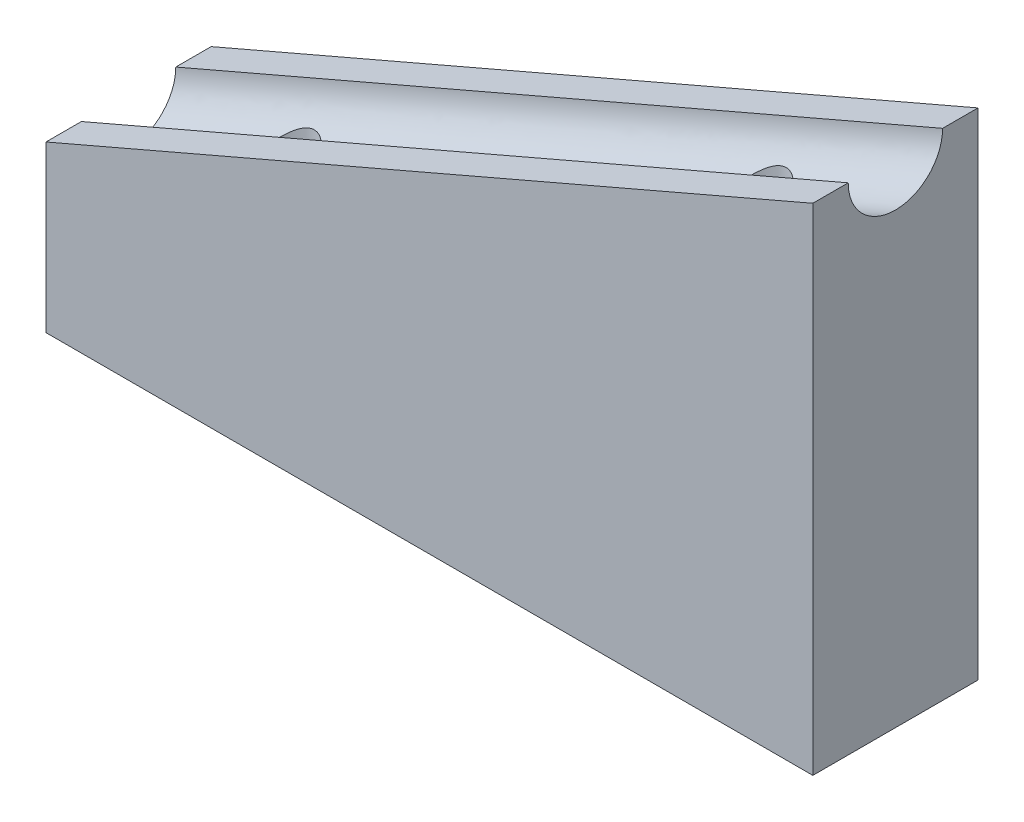
ISO-10303-21;
HEADER;
FILE_DESCRIPTION(('STEP AP214'),'2;1');
FILE_NAME('part.step','',(''),(''),'','','');
FILE_SCHEMA(('AUTOMOTIVE_DESIGN { 1 0 10303 214 1 1 1 1 }'));
ENDSEC;
DATA;
#1=APPLICATION_CONTEXT('core data for automotive mechanical design processes');
#2=APPLICATION_PROTOCOL_DEFINITION('international standard','automotive_design',2000,#1);
#3=PRODUCT_CONTEXT('',#1,'mechanical');
#4=PRODUCT('Part','Part','',(#3));
#5=PRODUCT_RELATED_PRODUCT_CATEGORY('part','',(#4));
#6=PRODUCT_DEFINITION_FORMATION('','',#4);
#7=PRODUCT_DEFINITION_CONTEXT('part definition',#1,'design');
#8=PRODUCT_DEFINITION('design','',#6,#7);
#9=PRODUCT_DEFINITION_SHAPE('','',#8);
#10=(LENGTH_UNIT() NAMED_UNIT(*) SI_UNIT(.MILLI.,.METRE.));
#11=(NAMED_UNIT(*) PLANE_ANGLE_UNIT() SI_UNIT($,.RADIAN.));
#12=(NAMED_UNIT(*) SI_UNIT($,.STERADIAN.) SOLID_ANGLE_UNIT());
#13=UNCERTAINTY_MEASURE_WITH_UNIT(LENGTH_MEASURE(1.E-05),#10,'distance_accuracy_value','');
#14=(GEOMETRIC_REPRESENTATION_CONTEXT(3) GLOBAL_UNCERTAINTY_ASSIGNED_CONTEXT((#13)) GLOBAL_UNIT_ASSIGNED_CONTEXT((#10,
#11,#12)) REPRESENTATION_CONTEXT('',''));
#15=CARTESIAN_POINT('',(0.,0.,0.));
#16=DIRECTION('',(0.,0.,1.));
#17=DIRECTION('',(1.,0.,0.));
#18=AXIS2_PLACEMENT_3D('',#15,#16,#17);
#19=CARTESIAN_POINT('',(10.,21.001,0.));
#20=DIRECTION('',(0.,-1.,0.));
#21=DIRECTION('',(0.,0.,-1.));
#22=AXIS2_PLACEMENT_3D('',#19,#20,#21);
#23=CYLINDRICAL_SURFACE('',#22,1.35);
#24=CARTESIAN_POINT('',(10.,0.,0.));
#25=DIRECTION('',(0.,-1.,0.));
#26=DIRECTION('',(0.,0.,-1.));
#27=AXIS2_PLACEMENT_3D('',#24,#25,#26);
#28=CIRCLE('',#27,1.35);
#29=CARTESIAN_POINT('',(10.,0.,-1.35));
#30=VERTEX_POINT('',#29);
#31=EDGE_CURVE('E120',#30,#30,#28,.T.);
#32=ORIENTED_EDGE('',*,*,#31,.T.);
#33=EDGE_LOOP('',(#32));
#34=FACE_BOUND('',#33,.T.);
#35=CARTESIAN_POINT('',(10.,16.8320568513549,-1.35));
#36=CARTESIAN_POINT('',(10.0581892493517,16.8571161828694,-1.34999695584091));
#37=CARTESIAN_POINT('',(10.117689879912,16.8792698979281,-1.34622545764739));
#38=CARTESIAN_POINT('',(10.2377178476309,16.9166195054488,-1.33028072745485));
#39=CARTESIAN_POINT('',(10.2982443067559,16.9318210645745,-1.31811435843607));
#40=CARTESIAN_POINT('',(10.4183067517538,16.9552191197305,-1.28506726812695));
#41=CARTESIAN_POINT('',(10.4778419767307,16.9634104575232,-1.26418014674654));
#42=CARTESIAN_POINT('',(10.5938454970746,16.9737970792146,-1.21402201849078));
#43=CARTESIAN_POINT('',(10.6503107457048,16.9759865093911,-1.18474285748452));
#44=CARTESIAN_POINT('',(10.7585966546614,16.9759879139981,-1.11851135167054));
#45=CARTESIAN_POINT('',(10.8104113736671,16.9737943698205,-1.08154938593606));
#46=CARTESIAN_POINT('',(10.9082166249761,16.9667089607962,-1.00083333683143));
#47=CARTESIAN_POINT('',(10.9542058850663,16.9618165077838,-0.957077774445919));
#48=CARTESIAN_POINT('',(11.0455561550492,16.9500324704395,-0.857041983091266));
#49=CARTESIAN_POINT('',(11.0899156590863,16.9429563388438,-0.799865699905447));
#50=CARTESIAN_POINT('',(11.1689625751605,16.9289621748495,-0.679143808270296));
#51=CARTESIAN_POINT('',(11.2036464353814,16.9220442013622,-0.615595872467857));
#52=CARTESIAN_POINT('',(11.2640939390793,16.9093239040538,-0.479973833817073));
#53=CARTESIAN_POINT('',(11.2892566835608,16.903604659213,-0.407622388865825));
#54=CARTESIAN_POINT('',(11.3270136238218,16.8948223855121,-0.259558005815488));
#55=CARTESIAN_POINT('',(11.3396095231221,16.8917589966402,-0.183845524781305));
#56=CARTESIAN_POINT('',(11.3516657231907,16.8888282136257,-0.0330427424830734));
#57=CARTESIAN_POINT('',(11.3514160171442,16.8888902611955,0.042023046605955));
#58=CARTESIAN_POINT('',(11.3385089190976,16.8920249988464,0.191008791146336));
#59=CARTESIAN_POINT('',(11.3258523863558,16.8950974804341,0.264928825588956));
#60=CARTESIAN_POINT('',(11.288769766755,16.9037127206374,0.408682104463888));
#61=CARTESIAN_POINT('',(11.2644803946633,16.9092267298171,0.478552509873517));
#62=CARTESIAN_POINT('',(11.204907102304,16.921793908186,0.613292438242508));
#63=CARTESIAN_POINT('',(11.169620957346,16.9288473887297,0.678160945982925));
#64=CARTESIAN_POINT('',(11.0879512091535,16.9433022911812,0.802842567213183));
#65=CARTESIAN_POINT('',(11.0413092760711,16.9507080009964,0.862486122799828));
#66=CARTESIAN_POINT('',(10.9385654063231,16.9636881199227,0.973296065277284));
#67=CARTESIAN_POINT('',(10.8824587763643,16.9692616164247,1.02445822138788));
#68=CARTESIAN_POINT('',(10.7623030576895,16.9759908713921,1.1167467014632));
#69=CARTESIAN_POINT('',(10.698261119534,16.9771505776888,1.15788196295112));
#70=CARTESIAN_POINT('',(10.5644372941803,16.9721178237646,1.22866215241053));
#71=CARTESIAN_POINT('',(10.4946676870027,16.9659407291358,1.25833092262822));
#72=CARTESIAN_POINT('',(10.3611372475985,16.9452604678489,1.30246538758772));
#73=CARTESIAN_POINT('',(10.2976700697109,16.9318544894469,1.31833569762009));
#74=CARTESIAN_POINT('',(10.1712249653992,16.8972281175589,1.34063730866518));
#75=CARTESIAN_POINT('',(10.108247157837,16.8760058826671,1.34706638366733));
#76=CARTESIAN_POINT('',(9.97582241174665,16.8231392121995,1.35163990487206));
#77=CARTESIAN_POINT('',(9.90676492875076,16.7904285387764,1.34844501165366));
#78=CARTESIAN_POINT('',(9.77322886838145,16.7185379305281,1.3325242380156));
#79=CARTESIAN_POINT('',(9.7087608867775,16.6793436783641,1.31977703878173));
#80=CARTESIAN_POINT('',(9.60274233034577,16.6089921470273,1.29103169017702));
#81=CARTESIAN_POINT('',(9.55996747514732,16.5788003927939,1.2770483634067));
#82=CARTESIAN_POINT('',(9.47677733798638,16.5171531408133,1.24527981623839));
#83=CARTESIAN_POINT('',(9.43636308109166,16.4856971039259,1.22749295959126));
#84=CARTESIAN_POINT('',(9.35774956612919,16.4220996922487,1.1882544821738));
#85=CARTESIAN_POINT('',(9.31955584974846,16.3899568554093,1.16679417896654));
#86=CARTESIAN_POINT('',(9.24544917438278,16.3256285372513,1.12029773421234));
#87=CARTESIAN_POINT('',(9.20953634167178,16.2934430536722,1.09526139493827));
#88=CARTESIAN_POINT('',(9.13910478511912,16.2287257177349,1.04086012182665));
#89=CARTESIAN_POINT('',(9.10464790839867,16.1962071585154,1.01139835068813));
#90=CARTESIAN_POINT('',(9.03833913378954,16.132329754604,0.948576872853809));
#91=CARTESIAN_POINT('',(9.00648809779086,16.1009712954824,0.9152158852696));
#92=CARTESIAN_POINT('',(8.91548062119563,16.0098842981942,0.809288450678186));
#93=CARTESIAN_POINT('',(8.86042568207587,15.9527252211936,0.73054317414034));
#94=CARTESIAN_POINT('',(8.78741583041091,15.8755160107623,0.595872463638503));
#95=CARTESIAN_POINT('',(8.76395716540502,15.8503905839175,0.545787051511079));
#96=CARTESIAN_POINT('',(8.72276830169219,15.8059434176366,0.440849220321658));
#97=CARTESIAN_POINT('',(8.70503381678295,15.7866173364811,0.386000407280323));
#98=CARTESIAN_POINT('',(8.67633888717587,15.7552129723191,0.27186835690804));
#99=CARTESIAN_POINT('',(8.66544916523486,15.7432103945573,0.212545696058065));
#100=CARTESIAN_POINT('',(8.6517666200703,15.728113756271,0.0918699466041976));
#101=CARTESIAN_POINT('',(8.64896511598708,15.7250101447578,0.030519106399103));
#102=CARTESIAN_POINT('',(8.65154208127767,15.7278584466396,-0.0834698906846887));
#103=CARTESIAN_POINT('',(8.65586873018173,15.7326459977453,-0.136167638812256));
#104=CARTESIAN_POINT('',(8.67042454393443,15.7486887353592,-0.239721103139412));
#105=CARTESIAN_POINT('',(8.68065628579402,15.7599467455981,-0.290576004807463));
#106=CARTESIAN_POINT('',(8.70928476449042,15.7912567068025,-0.400602968595962));
#107=CARTESIAN_POINT('',(8.72901325058667,15.8127305497315,-0.459019096897099));
#108=CARTESIAN_POINT('',(8.77490184537768,15.8621309754105,-0.570330312449072));
#109=CARTESIAN_POINT('',(8.80107377212832,15.89006940928,-0.623214997506417));
#110=CARTESIAN_POINT('',(8.87016411505526,15.9627613577984,-0.743317074956531));
#111=CARTESIAN_POINT('',(8.91558152076457,16.0097548293379,-0.807726227455414));
#112=CARTESIAN_POINT('',(9.01422702747777,16.1089011059169,-0.925567572302046));
#113=CARTESIAN_POINT('',(9.06746624886525,16.1610612214675,-0.978983871997904));
#114=CARTESIAN_POINT('',(9.18276839447812,16.2695908833411,-1.07730627354351));
#115=CARTESIAN_POINT('',(9.24508928603763,16.326045044971,-1.12181305256962));
#116=CARTESIAN_POINT('',(9.37677598998809,16.4384963552912,-1.19998467616572));
#117=CARTESIAN_POINT('',(9.44614848082725,16.4944930154439,-1.23363911444236));
#118=CARTESIAN_POINT('',(9.55560317330695,16.5755474882061,-1.27535346228652));
#119=CARTESIAN_POINT('',(9.59297336253112,16.6020667843079,-1.28779420214522));
#120=CARTESIAN_POINT('',(9.66960761653388,16.6536566569043,-1.3095531347228));
#121=CARTESIAN_POINT('',(9.70887197550838,16.678727007016,-1.31887084058504));
#122=CARTESIAN_POINT('',(9.78914544022837,16.7267612479474,-1.33405462289524));
#123=CARTESIAN_POINT('',(9.83014824546751,16.7497319284941,-1.33993218298276));
#124=CARTESIAN_POINT('',(9.91385792102711,16.7930258338396,-1.3479047088559));
#125=CARTESIAN_POINT('',(9.95656360043675,16.8133508678859,-1.35000227236666));
#126=CARTESIAN_POINT('',(10.,16.8320568513549,-1.35));
#127=B_SPLINE_CURVE_WITH_KNOTS('',3,(#35,#36,#37,#38,#39,#40,#41,#42,#43,#44,#45,#46,#47,#48,
#49,#50,#51,#52,#53,#54,#55,#56,#57,#58,#59,#60,#61,#62,#63,#64,#65,#66,#67,#68,#69,#70,#71,#72,
#73,#74,#75,#76,#77,#78,#79,#80,#81,#82,#83,#84,#85,#86,#87,#88,#89,#90,#91,#92,#93,#94,#95,#96,
#97,#98,#99,#100,#101,#102,#103,#104,#105,#106,#107,#108,#109,#110,#111,#112,#113,#114,#115,
#116,#117,#118,#119,#120,#121,#122,#123,#124,#125,#126),.UNSPECIFIED.,.T.,.F.,(4,2,2,2,2,2,2,2,
2,2,2,2,2,2,2,2,2,2,2,2,2,2,2,2,2,2,2,2,2,2,2,2,2,2,2,2,2,2,2,2,2,2,2,2,2,4),(0.,
0.189914865213358,0.379674654769765,0.56957395298367,0.759658396147937,0.949982325669388,
1.14034774834412,1.35753522981081,1.57480233367402,1.80411060840858,2.03338779463247,
2.25749130512457,2.48157929600038,2.70309601511104,2.92465757704781,3.15182822668951,
3.3791118571819,3.60619215029203,3.83279770249812,4.03200025757433,4.23124977216768,
4.45944732978611,4.68815570064973,4.85053848055404,5.01299125731481,5.17583344216987,
5.33868463442578,5.50583573359519,5.67304189686904,6.00539162628365,6.1870625452519,
6.36859711376722,6.55197780003594,6.73516159560541,6.89365057999023,7.05220878208597,
7.24700981380638,7.44217083146592,7.71594980639534,7.99012185236854,8.2746862985214,
8.55952280723489,8.70184138984278,8.84418214849949,8.98604500517831,9.12781033228462),.UNSPECIFIED.);
#128=CARTESIAN_POINT('',(10.,16.8320568513549,-1.35));
#129=VERTEX_POINT('',#128);
#130=EDGE_CURVE('E154',#129,#129,#127,.T.);
#131=ORIENTED_EDGE('',*,*,#130,.F.);
#132=EDGE_LOOP('',(#131));
#133=FACE_BOUND('',#132,.T.);
#134=ADVANCED_FACE('F35',(#34,#133),#23,.F.);
#135=CARTESIAN_POINT('',(-10.,21.001,0.));
#136=DIRECTION('',(0.,-1.,0.));
#137=DIRECTION('',(0.,0.,-1.));
#138=AXIS2_PLACEMENT_3D('',#135,#136,#137);
#139=CYLINDRICAL_SURFACE('',#138,1.35);
#140=CARTESIAN_POINT('',(-10.,0.,0.));
#141=DIRECTION('',(0.,-1.,0.));
#142=DIRECTION('',(0.,0.,-1.));
#143=AXIS2_PLACEMENT_3D('',#140,#141,#142);
#144=CIRCLE('',#143,1.35);
#145=CARTESIAN_POINT('',(-10.,0.,-1.35));
#146=VERTEX_POINT('',#145);
#147=EDGE_CURVE('E122',#146,#146,#144,.T.);
#148=ORIENTED_EDGE('',*,*,#147,.T.);
#149=EDGE_LOOP('',(#148));
#150=FACE_BOUND('',#149,.T.);
#151=CARTESIAN_POINT('',(-10.,8.21667223597033,-1.35));
#152=CARTESIAN_POINT('',(-9.94181075064834,8.24173156748476,-1.34999695584091));
#153=CARTESIAN_POINT('',(-9.88231012008804,8.26388528254346,-1.34622545764739));
#154=CARTESIAN_POINT('',(-9.76228215236914,8.30123489006425,-1.33028072745486));
#155=CARTESIAN_POINT('',(-9.70175569324409,8.31643644918985,-1.31811435843607));
#156=CARTESIAN_POINT('',(-9.58169324824615,8.33983450434588,-1.28506726812695));
#157=CARTESIAN_POINT('',(-9.52215802326931,8.34802584213864,-1.26418014674654));
#158=CARTESIAN_POINT('',(-9.40615450292535,8.35841246382998,-1.21402201849078));
#159=CARTESIAN_POINT('',(-9.3496892542952,8.36060189400646,-1.18474285748452));
#160=CARTESIAN_POINT('',(-9.24140334533858,8.36060329861345,-1.11851135167054));
#161=CARTESIAN_POINT('',(-9.1895886263329,8.35840975443589,-1.08154938593606));
#162=CARTESIAN_POINT('',(-9.09178337502392,8.35132434541155,-1.00083333683143));
#163=CARTESIAN_POINT('',(-9.04579411493368,8.34643189239917,-0.957077774445911));
#164=CARTESIAN_POINT('',(-8.95444384495083,8.33464785505488,-0.857041983091256));
#165=CARTESIAN_POINT('',(-8.9100843409137,8.3275717234592,-0.799865699905439));
#166=CARTESIAN_POINT('',(-8.83103742483949,8.31357755946494,-0.679143808270288));
#167=CARTESIAN_POINT('',(-8.79635356461856,8.30665958597762,-0.615595872467847));
#168=CARTESIAN_POINT('',(-8.7359060609207,8.29393928866922,-0.47997383381706));
#169=CARTESIAN_POINT('',(-8.7107433164392,8.28822004382838,-0.407622388865811));
#170=CARTESIAN_POINT('',(-8.67298637617818,8.2794377701275,-0.259558005815475));
#171=CARTESIAN_POINT('',(-8.66039047687792,8.27637438125563,-0.183845524781291));
#172=CARTESIAN_POINT('',(-8.64833427680933,8.2734435982411,-0.0330427424830594));
#173=CARTESIAN_POINT('',(-8.6485839828558,8.27350564581092,0.0420230466059691));
#174=CARTESIAN_POINT('',(-8.66149108090236,8.27664038346177,0.19100879114635));
#175=CARTESIAN_POINT('',(-8.67414761364417,8.27971286504951,0.26492882558897));
#176=CARTESIAN_POINT('',(-8.71123023324497,8.28832810525281,0.408682104463901));
#177=CARTESIAN_POINT('',(-8.73551960533674,8.29384211443245,0.47855250987353));
#178=CARTESIAN_POINT('',(-8.79509289769605,8.30640929280135,0.613292438242519));
#179=CARTESIAN_POINT('',(-8.83037904265399,8.31346277334512,0.678160945982934));
#180=CARTESIAN_POINT('',(-8.91204879084648,8.32791767579661,0.802842567213191));
#181=CARTESIAN_POINT('',(-8.95869072392891,8.33532338561178,0.862486122799838));
#182=CARTESIAN_POINT('',(-9.06143459367695,8.34830350453812,0.973296065277294));
#183=CARTESIAN_POINT('',(-9.11754122363571,8.35387700104004,1.02445822138789));
#184=CARTESIAN_POINT('',(-9.2376969423105,8.36060625600751,1.1167467014632));
#185=CARTESIAN_POINT('',(-9.301738880466,8.36176596230419,1.15788196295113));
#186=CARTESIAN_POINT('',(-9.43556270581976,8.35673320837997,1.22866215241053));
#187=CARTESIAN_POINT('',(-9.50533231299727,8.35055611375119,1.25833092262822));
#188=CARTESIAN_POINT('',(-9.63886275240155,8.32987585246428,1.30246538758772));
#189=CARTESIAN_POINT('',(-9.70232993028912,8.31646987406226,1.31833569762009));
#190=CARTESIAN_POINT('',(-9.82877503460082,8.2818435021743,1.34063730866518));
#191=CARTESIAN_POINT('',(-9.89175284216301,8.2606212672825,1.34706638366732));
#192=CARTESIAN_POINT('',(-10.0241775882534,8.20775459681487,1.35163990487206));
#193=CARTESIAN_POINT('',(-10.0932350712493,8.1750439233918,1.34844501165365));
#194=CARTESIAN_POINT('',(-10.2267711316186,8.10315331514345,1.33252423801559));
#195=CARTESIAN_POINT('',(-10.2912391132225,8.06395906297946,1.31977703878173));
#196=CARTESIAN_POINT('',(-10.3972576696543,7.99360753164266,1.29103169017702));
#197=CARTESIAN_POINT('',(-10.4400325248527,7.96341577740927,1.27704836340669));
#198=CARTESIAN_POINT('',(-10.5232226620136,7.9017685254287,1.24527981623837));
#199=CARTESIAN_POINT('',(-10.5636369189084,7.87031248854122,1.22749295959124));
#200=CARTESIAN_POINT('',(-10.6422504338708,7.80671507686408,1.18825448217378));
#201=CARTESIAN_POINT('',(-10.6804441502516,7.77457224002464,1.16679417896653));
#202=CARTESIAN_POINT('',(-10.7545508256172,7.71024392186662,1.12029773421232));
#203=CARTESIAN_POINT('',(-10.7904636583282,7.67805843828757,1.09526139493824));
#204=CARTESIAN_POINT('',(-10.8608952148809,7.61334110235023,1.04086012182662));
#205=CARTESIAN_POINT('',(-10.8953520916014,7.58082254313074,1.0113983506881));
#206=CARTESIAN_POINT('',(-10.9616608662105,7.51694513921932,0.94857687285378));
#207=CARTESIAN_POINT('',(-10.9935119022092,7.48558668009779,0.915215885269565));
#208=CARTESIAN_POINT('',(-11.0845193788044,7.39449968280954,0.809288450678142));
#209=CARTESIAN_POINT('',(-11.1395743179242,7.337340605809,0.730543174140296));
#210=CARTESIAN_POINT('',(-11.2125841695891,7.26013139537767,0.595872463638455));
#211=CARTESIAN_POINT('',(-11.236042834595,7.23500596853283,0.545787051511028));
#212=CARTESIAN_POINT('',(-11.2772316983078,7.19055880225197,0.440849220321608));
#213=CARTESIAN_POINT('',(-11.2949661832171,7.17123272109643,0.386000407280275));
#214=CARTESIAN_POINT('',(-11.3236611128241,7.13982835693451,0.271868356907995));
#215=CARTESIAN_POINT('',(-11.3345508347651,7.12782577917263,0.212545696058023));
#216=CARTESIAN_POINT('',(-11.3482333799297,7.11272914088641,0.091869946604159));
#217=CARTESIAN_POINT('',(-11.3510348840129,7.10962552937322,0.0305191063990653));
#218=CARTESIAN_POINT('',(-11.3484579187223,7.11247383125497,-0.0834698906847246));
#219=CARTESIAN_POINT('',(-11.3441312698183,7.11726138236067,-0.136167638812291));
#220=CARTESIAN_POINT('',(-11.3295754560656,7.13330411997464,-0.239721103139445));
#221=CARTESIAN_POINT('',(-11.319343714206,7.14456213021349,-0.290576004807494));
#222=CARTESIAN_POINT('',(-11.2907152355096,7.1758720914179,-0.400602968595993));
#223=CARTESIAN_POINT('',(-11.2709867494133,7.19734593434686,-0.459019096897131));
#224=CARTESIAN_POINT('',(-11.2250981546223,7.24674636002591,-0.570330312449103));
#225=CARTESIAN_POINT('',(-11.1989262278717,7.27468479389545,-0.623214997506446));
#226=CARTESIAN_POINT('',(-11.1298358849447,7.34737674241377,-0.743317074956561));
#227=CARTESIAN_POINT('',(-11.0844184792354,7.3943702139533,-0.807726227455448));
#228=CARTESIAN_POINT('',(-10.9857729725222,7.49351649053234,-0.925567572302078));
#229=CARTESIAN_POINT('',(-10.9325337511347,7.54567660608297,-0.978983871997931));
#230=CARTESIAN_POINT('',(-10.8172316055218,7.65420626795655,-1.07730627354354));
#231=CARTESIAN_POINT('',(-10.7549107139623,7.71066042958645,-1.12181305256965));
#232=CARTESIAN_POINT('',(-10.6232240100119,7.8231117399066,-1.19998467616575));
#233=CARTESIAN_POINT('',(-10.5538515191727,7.87910840005936,-1.23363911444239));
#234=CARTESIAN_POINT('',(-10.444396826693,7.96016287282152,-1.27535346228654));
#235=CARTESIAN_POINT('',(-10.4070266374688,7.98668216892329,-1.28779420214524));
#236=CARTESIAN_POINT('',(-10.3303923834661,8.03827204151975,-1.30955313472281));
#237=CARTESIAN_POINT('',(-10.2911280244916,8.06334239163141,-1.31887084058505));
#238=CARTESIAN_POINT('',(-10.2108545597716,8.11137663256283,-1.33405462289525));
#239=CARTESIAN_POINT('',(-10.1698517545325,8.13434731310953,-1.33993218298277));
#240=CARTESIAN_POINT('',(-10.0861420789729,8.17764121845499,-1.3479047088559));
#241=CARTESIAN_POINT('',(-10.0434363995632,8.19796625250128,-1.35000227236667));
#242=CARTESIAN_POINT('',(-10.,8.21667223597033,-1.35));
#243=B_SPLINE_CURVE_WITH_KNOTS('',3,(#151,#152,#153,#154,#155,#156,#157,#158,#159,#160,#161,
#162,#163,#164,#165,#166,#167,#168,#169,#170,#171,#172,#173,#174,#175,#176,#177,#178,#179,#180,
#181,#182,#183,#184,#185,#186,#187,#188,#189,#190,#191,#192,#193,#194,#195,#196,#197,#198,#199,
#200,#201,#202,#203,#204,#205,#206,#207,#208,#209,#210,#211,#212,#213,#214,#215,#216,#217,#218,
#219,#220,#221,#222,#223,#224,#225,#226,#227,#228,#229,#230,#231,#232,#233,#234,#235,#236,#237,
#238,#239,#240,#241,#242),.UNSPECIFIED.,.T.,.F.,(4,2,2,2,2,2,2,2,2,2,2,2,2,2,2,2,2,2,2,2,2,2,2,
2,2,2,2,2,2,2,2,2,2,2,2,2,2,2,2,2,2,2,2,2,2,4),(0.,0.189914865213361,0.379674654769771,
0.569573952983682,0.759658396147952,0.949982325669397,1.14034774834412,1.35753522981082,
1.57480233367403,1.8041106084086,2.03338779463248,2.25749130512458,2.48157929600039,
2.70309601511105,2.92465757704783,3.15182822668952,3.37911185718192,3.60619215029204,
3.83279770249813,4.03200025757434,4.23124977216769,4.45944732978613,4.68815570064975,
4.85053848055406,5.01299125731484,5.1758334421699,5.33868463442582,5.50583573359523,
5.67304189686909,6.0053916262837,6.18706254525194,6.36859711376725,6.55197780003597,
6.73516159560544,6.89365057999025,7.05220878208598,7.2470098138064,7.44217083146595,
7.71594980639537,7.99012185236858,8.27468629852145,8.55952280723495,8.70184138984282,
8.84418214849951,8.98604500517831,9.12781033228461),.UNSPECIFIED.);
#244=CARTESIAN_POINT('',(-10.,8.21667223597033,-1.35));
#245=VERTEX_POINT('',#244);
#246=EDGE_CURVE('E39',#245,#245,#243,.T.);
#247=ORIENTED_EDGE('',*,*,#246,.F.);
#248=EDGE_LOOP('',(#247));
#249=FACE_BOUND('',#248,.T.);
#250=ADVANCED_FACE('F137',(#150,#249),#139,.F.);
#251=CARTESIAN_POINT('',(-16.25,7.,-3.501));
#252=DIRECTION('',(0.395623896041664,-0.918412615811006,0.));
#253=DIRECTION('',(0.918412615811006,0.395623896041664,0.));
#254=AXIS2_PLACEMENT_3D('',#251,#252,#253);
#255=PLANE('',#254);
#256=DIRECTION('',(0.918412615811006,0.395623896041664,0.));
#257=VECTOR('',#256,1.);
#258=CARTESIAN_POINT('',(-17.2519105744263,6.56840775255485,2.));
#259=LINE('',#258,#257);
#260=CARTESIAN_POINT('',(-16.25,7.00000000000001,2.));
#261=VERTEX_POINT('',#260);
#262=CARTESIAN_POINT('',(16.25,21.,2.));
#263=VERTEX_POINT('',#262);
#264=EDGE_CURVE('E191',#261,#263,#259,.T.);
#265=ORIENTED_EDGE('',*,*,#264,.F.);
#266=DIRECTION('',(0.,0.,1.));
#267=VECTOR('',#266,1.);
#268=CARTESIAN_POINT('',(-16.25,7.,-3.501));
#269=LINE('',#268,#267);
#270=CARTESIAN_POINT('',(-16.25,7.,3.5));
#271=VERTEX_POINT('',#270);
#272=EDGE_CURVE('E201',#261,#271,#269,.T.);
#273=ORIENTED_EDGE('',*,*,#272,.T.);
#274=DIRECTION('',(0.918412615811006,0.395623896041664,0.));
#275=VECTOR('',#274,1.);
#276=CARTESIAN_POINT('',(-16.25,7.,3.5));
#277=LINE('',#276,#275);
#278=CARTESIAN_POINT('',(16.25,21.,3.5));
#279=VERTEX_POINT('',#278);
#280=EDGE_CURVE('E65',#271,#279,#277,.T.);
#281=ORIENTED_EDGE('',*,*,#280,.T.);
#282=DIRECTION('',(0.,0.,-1.));
#283=VECTOR('',#282,1.);
#284=CARTESIAN_POINT('',(16.25,21.,3.5));
#285=LINE('',#284,#283);
#286=EDGE_CURVE('E109',#279,#263,#285,.T.);
#287=ORIENTED_EDGE('',*,*,#286,.T.);
#288=EDGE_LOOP('',(#265,#273,#281,#287));
#289=FACE_BOUND('',#288,.T.);
#290=ADVANCED_FACE('F132',(#289),#255,.F.);
#291=CARTESIAN_POINT('',(16.25,21.,3.5));
#292=DIRECTION('',(-1.,0.,0.));
#293=DIRECTION('',(0.,0.,1.));
#294=AXIS2_PLACEMENT_3D('',#291,#292,#293);
#295=PLANE('',#294);
#296=CARTESIAN_POINT('',(16.25,21.,-2.));
#297=VERTEX_POINT('',#296);
#298=CARTESIAN_POINT('',(16.25,21.,-3.5));
#299=VERTEX_POINT('',#298);
#300=EDGE_CURVE('E106',#297,#299,#285,.T.);
#301=ORIENTED_EDGE('',*,*,#300,.F.);
#302=CARTESIAN_POINT('',(16.25,21.,-2.));
#303=CARTESIAN_POINT('',(16.25,20.9437319770414,-1.99999962636248));
#304=CARTESIAN_POINT('',(16.25,20.8874909120645,-1.99762394297045));
#305=CARTESIAN_POINT('',(16.25,20.7754112086993,-1.98814637398231));
#306=CARTESIAN_POINT('',(16.25,20.7195725511715,-1.98104471468587));
#307=CARTESIAN_POINT('',(16.25,20.5533519362704,-1.95271723971797));
#308=CARTESIAN_POINT('',(16.25,20.444083445218,-1.92446874658722));
#309=CARTESIAN_POINT('',(16.25,20.2318449317442,-1.8500291479816));
#310=CARTESIAN_POINT('',(16.25,20.1288778572242,-1.80382971793384));
#311=CARTESIAN_POINT('',(16.25,19.9321664917007,-1.69480587157955));
#312=CARTESIAN_POINT('',(16.25,19.8384203937606,-1.63198472139343));
#313=CARTESIAN_POINT('',(16.25,19.6628064204286,-1.49149611991164));
#314=CARTESIAN_POINT('',(16.25,19.5809388069698,-1.4138283413197));
#315=CARTESIAN_POINT('',(16.25,19.4313911982618,-1.24583855556633));
#316=CARTESIAN_POINT('',(16.25,19.3637133655604,-1.15551462307887));
#317=CARTESIAN_POINT('',(16.25,19.2444866335461,-0.964790249796765));
#318=CARTESIAN_POINT('',(16.25,19.1929370223534,-0.864390254005507));
#319=CARTESIAN_POINT('',(16.25,19.107428375214,-0.656367388951673));
#320=CARTESIAN_POINT('',(16.25,19.0734682140192,-0.548744982225259));
#321=CARTESIAN_POINT('',(16.25,19.0240972822818,-0.329323889979125));
#322=CARTESIAN_POINT('',(16.25,19.008686891866,-0.217525118924608));
#323=CARTESIAN_POINT('',(16.25,18.9968531247563,0.00707455170470371));
#324=CARTESIAN_POINT('',(16.25,19.0004301847825,0.11987547426988));
#325=CARTESIAN_POINT('',(16.25,19.0264741533316,0.34327769862088));
#326=CARTESIAN_POINT('',(16.25,19.0489408745834,0.453879022202262));
#327=CARTESIAN_POINT('',(16.25,19.1121130181866,0.669728020212934));
#328=CARTESIAN_POINT('',(16.25,19.1528183826767,0.774975711625184));
#329=CARTESIAN_POINT('',(16.25,19.2513622233817,0.977189487565663));
#330=CARTESIAN_POINT('',(16.25,19.3092011486299,1.07415535495943));
#331=CARTESIAN_POINT('',(16.25,19.4074532082223,1.21118381532483));
#332=CARTESIAN_POINT('',(16.25,19.442126735292,1.25546374327582));
#333=CARTESIAN_POINT('',(16.25,19.5151100007609,1.34099378975958));
#334=CARTESIAN_POINT('',(16.25,19.5534232160162,1.38224094311619));
#335=CARTESIAN_POINT('',(16.25,19.6733308906751,1.50085475446143));
#336=CARTESIAN_POINT('',(16.25,19.7599816122285,1.5732165588797));
#337=CARTESIAN_POINT('',(16.25,19.944213934307,1.70234170089148));
#338=CARTESIAN_POINT('',(16.25,20.0417951189034,1.75910563173566));
#339=CARTESIAN_POINT('',(16.25,20.194227844549,1.83136904196662));
#340=CARTESIAN_POINT('',(16.25,20.246105992787,1.85332586226172));
#341=CARTESIAN_POINT('',(16.25,20.3514990806668,1.89277724351977));
#342=CARTESIAN_POINT('',(16.25,20.4050126549963,1.91027541858663));
#343=CARTESIAN_POINT('',(16.25,20.5132660667584,1.94068278373009));
#344=CARTESIAN_POINT('',(16.25,20.5680046478936,1.95359646503549));
#345=CARTESIAN_POINT('',(16.25,20.6783648366404,1.97476719521832));
#346=CARTESIAN_POINT('',(16.25,20.733986180681,1.98302560811731));
#347=CARTESIAN_POINT('',(16.25,20.8247737659489,1.99261890883234));
#348=CARTESIAN_POINT('',(16.25,20.8597947248543,1.99538857922093));
#349=CARTESIAN_POINT('',(16.25,20.9298758897177,1.99907778719103));
#350=CARTESIAN_POINT('',(16.25,20.9649359350846,2.0000003757597));
#351=CARTESIAN_POINT('',(16.25,21.,2.));
#352=B_SPLINE_CURVE_WITH_KNOTS('',3,(#302,#303,#304,#305,#306,#307,#308,#309,#310,#311,#312,
#313,#314,#315,#316,#317,#318,#319,#320,#321,#322,#323,#324,#325,#326,#327,#328,#329,#330,#331,
#332,#333,#334,#335,#336,#337,#338,#339,#340,#341,#342,#343,#344,#345,#346,#347,#348,#349,#350,
#351),.UNSPECIFIED.,.F.,.F.,(4,2,2,2,2,2,2,2,2,2,2,2,2,2,2,2,2,2,2,2,2,2,2,2,4),(0.,
0.16870038499997,0.337392692494508,0.674238578643485,1.0112408606007,1.34817697168954,
1.6851205114449,2.0221153647283,2.35909534137676,2.69605375777923,3.03301907910825,
3.36999215083148,3.70696188186424,4.04393054388435,4.38090803790351,4.5494570745835,
4.71816877057879,5.05514437627756,5.39210716364681,5.56093987115576,5.72963528716622,
5.89816498059225,6.06664526810625,6.1719914869416,6.27716355214019),.UNSPECIFIED.);
#353=EDGE_CURVE('E56',#297,#263,#352,.T.);
#354=ORIENTED_EDGE('',*,*,#353,.T.);
#355=ORIENTED_EDGE('',*,*,#286,.F.);
#356=DIRECTION('',(0.,-1.,0.));
#357=VECTOR('',#356,1.);
#358=CARTESIAN_POINT('',(16.25,21.,3.5));
#359=LINE('',#358,#357);
#360=CARTESIAN_POINT('',(16.25,0.,3.5));
#361=VERTEX_POINT('',#360);
#362=EDGE_CURVE('E91',#279,#361,#359,.T.);
#363=ORIENTED_EDGE('',*,*,#362,.T.);
#364=DIRECTION('',(0.,0.,-1.));
#365=VECTOR('',#364,1.);
#366=CARTESIAN_POINT('',(16.25,0.,3.5));
#367=LINE('',#366,#365);
#368=CARTESIAN_POINT('',(16.25,0.,-3.5));
#369=VERTEX_POINT('',#368);
#370=EDGE_CURVE('E105',#361,#369,#367,.T.);
#371=ORIENTED_EDGE('',*,*,#370,.T.);
#372=DIRECTION('',(0.,-1.,0.));
#373=VECTOR('',#372,1.);
#374=CARTESIAN_POINT('',(16.25,21.,-3.5));
#375=LINE('',#374,#373);
#376=EDGE_CURVE('E11',#299,#369,#375,.T.);
#377=ORIENTED_EDGE('',*,*,#376,.F.);
#378=EDGE_LOOP('',(#301,#354,#355,#363,#371,#377));
#379=FACE_BOUND('',#378,.T.);
#380=ADVANCED_FACE('F37',(#379),#295,.F.);
#381=CARTESIAN_POINT('',(-16.25,21.,-3.5));
#382=DIRECTION('',(0.,0.,1.));
#383=DIRECTION('',(1.,0.,0.));
#384=AXIS2_PLACEMENT_3D('',#381,#382,#383);
#385=PLANE('',#384);
#386=DIRECTION('',(0.,-1.,0.));
#387=VECTOR('',#386,1.);
#388=CARTESIAN_POINT('',(-16.25,21.,-3.5));
#389=LINE('',#388,#387);
#390=CARTESIAN_POINT('',(-16.25,7.,-3.5));
#391=VERTEX_POINT('',#390);
#392=CARTESIAN_POINT('',(-16.25,0.,-3.5));
#393=VERTEX_POINT('',#392);
#394=EDGE_CURVE('E49',#391,#393,#389,.T.);
#395=ORIENTED_EDGE('',*,*,#394,.F.);
#396=DIRECTION('',(-0.918412615811006,-0.395623896041664,0.));
#397=VECTOR('',#396,1.);
#398=CARTESIAN_POINT('',(-16.25,7.,-3.5));
#399=LINE('',#398,#397);
#400=EDGE_CURVE('E129',#299,#391,#399,.T.);
#401=ORIENTED_EDGE('',*,*,#400,.F.);
#402=ORIENTED_EDGE('',*,*,#376,.T.);
#403=DIRECTION('',(-1.,0.,0.));
#404=VECTOR('',#403,1.);
#405=CARTESIAN_POINT('',(-16.25,0.,-3.5));
#406=LINE('',#405,#404);
#407=EDGE_CURVE('E100',#369,#393,#406,.T.);
#408=ORIENTED_EDGE('',*,*,#407,.T.);
#409=EDGE_LOOP('',(#395,#401,#402,#408));
#410=FACE_BOUND('',#409,.T.);
#411=ADVANCED_FACE('F124',(#410),#385,.F.);
#412=CARTESIAN_POINT('',(-16.25,21.,3.5));
#413=DIRECTION('',(1.,0.,0.));
#414=DIRECTION('',(0.,0.,-1.));
#415=AXIS2_PLACEMENT_3D('',#412,#413,#414);
#416=PLANE('',#415);
#417=ORIENTED_EDGE('',*,*,#272,.F.);
#418=CARTESIAN_POINT('',(-16.25,7.00000000000001,2.));
#419=CARTESIAN_POINT('',(-16.25,6.94373197704145,1.99999962636248));
#420=CARTESIAN_POINT('',(-16.25,6.88749091206453,1.99762394297045));
#421=CARTESIAN_POINT('',(-16.25,6.77541120869936,1.98814637398231));
#422=CARTESIAN_POINT('',(-16.25,6.71957255117156,1.98104471468587));
#423=CARTESIAN_POINT('',(-16.25,6.55335193627038,1.95271723971796));
#424=CARTESIAN_POINT('',(-16.25,6.44408344521804,1.92446874658722));
#425=CARTESIAN_POINT('',(-16.25,6.23184493174419,1.8500291479816));
#426=CARTESIAN_POINT('',(-16.25,6.12887785722416,1.80382971793384));
#427=CARTESIAN_POINT('',(-16.25,5.93216649170069,1.69480587157954));
#428=CARTESIAN_POINT('',(-16.25,5.83842039376061,1.63198472139343));
#429=CARTESIAN_POINT('',(-16.25,5.66280642042862,1.49149611991164));
#430=CARTESIAN_POINT('',(-16.25,5.58093880696979,1.41382834131969));
#431=CARTESIAN_POINT('',(-16.25,5.43139119826179,1.24583855556633));
#432=CARTESIAN_POINT('',(-16.25,5.36371336556042,1.15551462307887));
#433=CARTESIAN_POINT('',(-16.25,5.2444866335461,0.964790249796763));
#434=CARTESIAN_POINT('',(-16.25,5.19293702235343,0.864390254005506));
#435=CARTESIAN_POINT('',(-16.25,5.10742837521396,0.656367388951674));
#436=CARTESIAN_POINT('',(-16.25,5.07346821401925,0.54874498222526));
#437=CARTESIAN_POINT('',(-16.25,5.02409728228179,0.329323889979126));
#438=CARTESIAN_POINT('',(-16.25,5.00868689186602,0.217525118924607));
#439=CARTESIAN_POINT('',(-16.25,4.99685312475626,-0.00707455170470694));
#440=CARTESIAN_POINT('',(-16.25,5.00043018478254,-0.119875474269884));
#441=CARTESIAN_POINT('',(-16.25,5.02647415333156,-0.343277698620885));
#442=CARTESIAN_POINT('',(-16.25,5.04894087458338,-0.453879022202268));
#443=CARTESIAN_POINT('',(-16.25,5.11211301818656,-0.669728020212939));
#444=CARTESIAN_POINT('',(-16.25,5.1528183826767,-0.774975711625189));
#445=CARTESIAN_POINT('',(-16.25,5.25136222338166,-0.977189487565668));
#446=CARTESIAN_POINT('',(-16.25,5.30920114862993,-1.07415535495944));
#447=CARTESIAN_POINT('',(-16.25,5.40745320822226,-1.21118381532483));
#448=CARTESIAN_POINT('',(-16.25,5.44212673529197,-1.25546374327582));
#449=CARTESIAN_POINT('',(-16.25,5.51511000076086,-1.34099378975958));
#450=CARTESIAN_POINT('',(-16.25,5.55342321601619,-1.3822409431162));
#451=CARTESIAN_POINT('',(-16.25,5.67333089067515,-1.50085475446144));
#452=CARTESIAN_POINT('',(-16.25,5.75998161222848,-1.5732165588797));
#453=CARTESIAN_POINT('',(-16.25,5.944213934307,-1.70234170089148));
#454=CARTESIAN_POINT('',(-16.25,6.04179511890337,-1.75910563173567));
#455=CARTESIAN_POINT('',(-16.25,6.19422784454902,-1.83136904196663));
#456=CARTESIAN_POINT('',(-16.25,6.24610599278702,-1.85332586226173));
#457=CARTESIAN_POINT('',(-16.25,6.35149908066681,-1.89277724351977));
#458=CARTESIAN_POINT('',(-16.25,6.40501265499634,-1.91027541858664));
#459=CARTESIAN_POINT('',(-16.25,6.51326606675843,-1.94068278373009));
#460=CARTESIAN_POINT('',(-16.25,6.56800464789357,-1.95359646503549));
#461=CARTESIAN_POINT('',(-16.25,6.67836483664038,-1.97476719521832));
#462=CARTESIAN_POINT('',(-16.25,6.733986180681,-1.98302560811731));
#463=CARTESIAN_POINT('',(-16.25,6.8247737659489,-1.99261890883234));
#464=CARTESIAN_POINT('',(-16.25,6.85979472485433,-1.99538857922093));
#465=CARTESIAN_POINT('',(-16.25,6.9298758897177,-1.99907778719104));
#466=CARTESIAN_POINT('',(-16.25,6.96493593508464,-2.0000003757597));
#467=CARTESIAN_POINT('',(-16.25,7.00000000000002,-2.));
#468=B_SPLINE_CURVE_WITH_KNOTS('',3,(#418,#419,#420,#421,#422,#423,#424,#425,#426,#427,#428,
#429,#430,#431,#432,#433,#434,#435,#436,#437,#438,#439,#440,#441,#442,#443,#444,#445,#446,#447,
#448,#449,#450,#451,#452,#453,#454,#455,#456,#457,#458,#459,#460,#461,#462,#463,#464,#465,#466,
#467),.UNSPECIFIED.,.F.,.F.,(4,2,2,2,2,2,2,2,2,2,2,2,2,2,2,2,2,2,2,2,2,2,2,2,4),(0.,
0.168700384999972,0.337392692494509,0.674238578643487,1.0112408606007,1.34817697168955,
1.68512051144491,2.0221153647283,2.35909534137676,2.69605375777923,3.03301907910825,
3.36999215083148,3.70696188186425,4.04393054388435,4.38090803790352,4.54945707458351,
4.7181687705788,5.05514437627758,5.39210716364682,5.56093987115577,5.72963528716622,
5.89816498059226,6.06664526810625,6.17199148694161,6.2771635521402),.UNSPECIFIED.);
#469=CARTESIAN_POINT('',(-16.25,7.00000000000001,-2.));
#470=VERTEX_POINT('',#469);
#471=EDGE_CURVE('E183',#261,#470,#468,.T.);
#472=ORIENTED_EDGE('',*,*,#471,.T.);
#473=EDGE_CURVE('E196',#391,#470,#269,.T.);
#474=ORIENTED_EDGE('',*,*,#473,.F.);
#475=ORIENTED_EDGE('',*,*,#394,.T.);
#476=DIRECTION('',(0.,0.,1.));
#477=VECTOR('',#476,1.);
#478=CARTESIAN_POINT('',(-16.25,0.,3.5));
#479=LINE('',#478,#477);
#480=CARTESIAN_POINT('',(-16.25,0.,3.5));
#481=VERTEX_POINT('',#480);
#482=EDGE_CURVE('E94',#393,#481,#479,.T.);
#483=ORIENTED_EDGE('',*,*,#482,.T.);
#484=DIRECTION('',(0.,-1.,0.));
#485=VECTOR('',#484,1.);
#486=CARTESIAN_POINT('',(-16.25,21.,3.5));
#487=LINE('',#486,#485);
#488=EDGE_CURVE('E82',#271,#481,#487,.T.);
#489=ORIENTED_EDGE('',*,*,#488,.F.);
#490=EDGE_LOOP('',(#417,#472,#474,#475,#483,#489));
#491=FACE_BOUND('',#490,.T.);
#492=ADVANCED_FACE('F95',(#491),#416,.F.);
#493=CARTESIAN_POINT('',(-16.25,21.,3.5));
#494=DIRECTION('',(0.,0.,-1.));
#495=DIRECTION('',(-1.,0.,0.));
#496=AXIS2_PLACEMENT_3D('',#493,#494,#495);
#497=PLANE('',#496);
#498=ORIENTED_EDGE('',*,*,#362,.F.);
#499=ORIENTED_EDGE('',*,*,#280,.F.);
#500=ORIENTED_EDGE('',*,*,#488,.T.);
#501=DIRECTION('',(1.,0.,0.));
#502=VECTOR('',#501,1.);
#503=CARTESIAN_POINT('',(-16.25,0.,3.5));
#504=LINE('',#503,#502);
#505=EDGE_CURVE('E86',#481,#361,#504,.T.);
#506=ORIENTED_EDGE('',*,*,#505,.T.);
#507=EDGE_LOOP('',(#498,#499,#500,#506));
#508=FACE_BOUND('',#507,.T.);
#509=ADVANCED_FACE('F84',(#508),#497,.F.);
#510=CARTESIAN_POINT('',(0.,0.,0.));
#511=DIRECTION('',(0.,-1.,0.));
#512=DIRECTION('',(0.,0.,-1.));
#513=AXIS2_PLACEMENT_3D('',#510,#511,#512);
#514=PLANE('',#513);
#515=ORIENTED_EDGE('',*,*,#147,.F.);
#516=EDGE_LOOP('',(#515));
#517=FACE_BOUND('',#516,.T.);
#518=ORIENTED_EDGE('',*,*,#31,.F.);
#519=EDGE_LOOP('',(#518));
#520=FACE_BOUND('',#519,.T.);
#521=ORIENTED_EDGE('',*,*,#370,.F.);
#522=ORIENTED_EDGE('',*,*,#505,.F.);
#523=ORIENTED_EDGE('',*,*,#482,.F.);
#524=ORIENTED_EDGE('',*,*,#407,.F.);
#525=EDGE_LOOP('',(#521,#522,#523,#524));
#526=FACE_BOUND('',#525,.T.);
#527=ADVANCED_FACE('F103',(#517,#520,#526),#514,.T.);
#528=ORIENTED_EDGE('',*,*,#473,.T.);
#529=DIRECTION('',(0.918412615811006,0.395623896041664,0.));
#530=VECTOR('',#529,1.);
#531=CARTESIAN_POINT('',(-17.2519105744263,6.56840775255485,-2.));
#532=LINE('',#531,#530);
#533=EDGE_CURVE('E192',#470,#297,#532,.T.);
#534=ORIENTED_EDGE('',*,*,#533,.T.);
#535=ORIENTED_EDGE('',*,*,#300,.T.);
#536=ORIENTED_EDGE('',*,*,#400,.T.);
#537=EDGE_LOOP('',(#528,#534,#535,#536));
#538=FACE_BOUND('',#537,.T.);
#539=ADVANCED_FACE('F139',(#538),#255,.F.);
#540=CARTESIAN_POINT('',(-17.2519105744263,6.56840775255485,-2.));
#541=CARTESIAN_POINT('',(17.2519105744263,21.4315922474452,-2.));
#542=CARTESIAN_POINT('',(-17.2519105744263,2.56840775255485,-2.));
#543=CARTESIAN_POINT('',(17.2519105744263,17.4315922474452,-2.));
#544=CARTESIAN_POINT('',(-17.2519105744263,2.56840775255485,2.));
#545=CARTESIAN_POINT('',(17.2519105744263,17.4315922474452,2.));
#546=CARTESIAN_POINT('',(-17.2519105744263,6.56840775255485,2.));
#547=CARTESIAN_POINT('',(17.2519105744263,21.4315922474452,2.));
#548=(BOUNDED_SURFACE() B_SPLINE_SURFACE(3,1,((#540,#541),(#542,#543),(#544,#545),(#546,#547)),
.UNSPECIFIED.,.F.,.F.,.F.) B_SPLINE_SURFACE_WITH_KNOTS((4,4),(2,2),(0.,1.),(0.,1.),
.UNSPECIFIED.) GEOMETRIC_REPRESENTATION_ITEM() RATIONAL_B_SPLINE_SURFACE(((1.,1.),
(0.333333333333333,0.333333333333333),(0.333333333333333,0.333333333333333),(1.,1.))) REPRESENTATION_ITEM('') SURFACE());
#549=ORIENTED_EDGE('',*,*,#533,.F.);
#550=ORIENTED_EDGE('',*,*,#471,.F.);
#551=ORIENTED_EDGE('',*,*,#264,.T.);
#552=ORIENTED_EDGE('',*,*,#353,.F.);
#553=EDGE_LOOP('',(#549,#550,#551,#552));
#554=FACE_BOUND('',#553,.T.);
#555=ORIENTED_EDGE('',*,*,#246,.T.);
#556=EDGE_LOOP('',(#555));
#557=FACE_BOUND('',#556,.T.);
#558=ORIENTED_EDGE('',*,*,#130,.T.);
#559=EDGE_LOOP('',(#558));
#560=FACE_BOUND('',#559,.T.);
#561=ADVANCED_FACE('F168',(#554,#557,#560),#548,.T.);
#562=CLOSED_SHELL('',(#134,#250,#290,#380,#411,#492,#509,#527,#539,#561));
#563=MANIFOLD_SOLID_BREP('B2',#562);
#564=ADVANCED_BREP_SHAPE_REPRESENTATION('',(#18,#563),#14);
#565=SHAPE_DEFINITION_REPRESENTATION(#9,#564);
ENDSEC;
END-ISO-10303-21;
